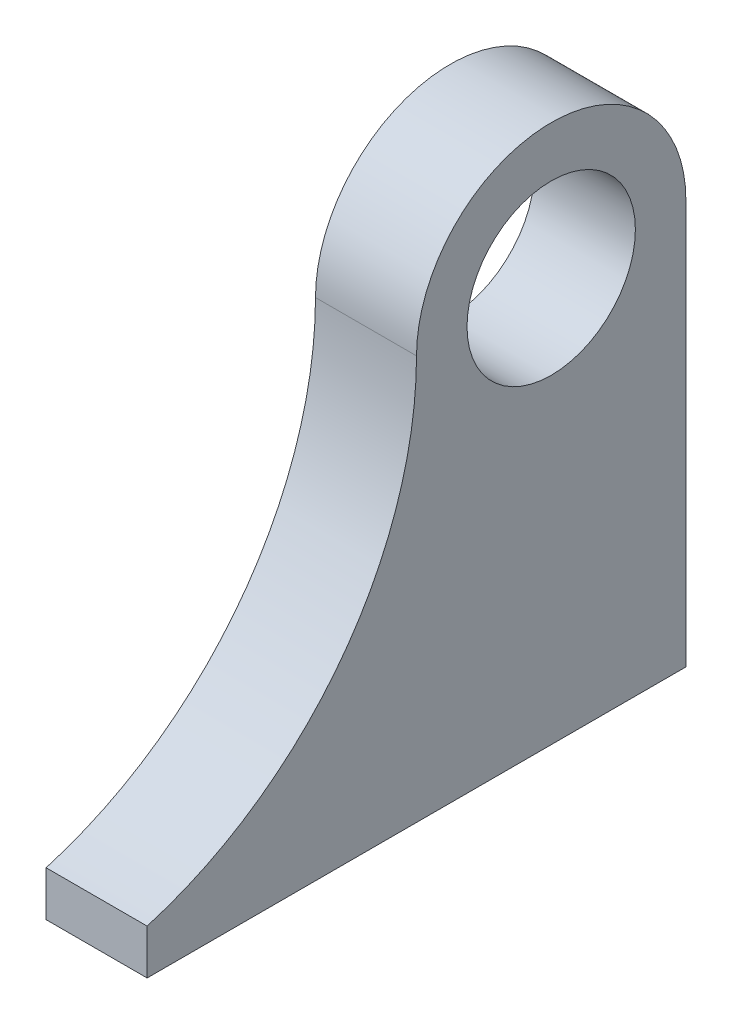
ISO-10303-21;
HEADER;
FILE_DESCRIPTION(('STEP AP214'),'2;1');
FILE_NAME('part.step','',(''),(''),'','','');
FILE_SCHEMA(('AUTOMOTIVE_DESIGN { 1 0 10303 214 1 1 1 1 }'));
ENDSEC;
DATA;
#1=APPLICATION_CONTEXT('core data for automotive mechanical design processes');
#2=APPLICATION_PROTOCOL_DEFINITION('international standard','automotive_design',2000,#1);
#3=PRODUCT_CONTEXT('',#1,'mechanical');
#4=PRODUCT('Part','Part','',(#3));
#5=PRODUCT_RELATED_PRODUCT_CATEGORY('part','',(#4));
#6=PRODUCT_DEFINITION_FORMATION('','',#4);
#7=PRODUCT_DEFINITION_CONTEXT('part definition',#1,'design');
#8=PRODUCT_DEFINITION('design','',#6,#7);
#9=PRODUCT_DEFINITION_SHAPE('','',#8);
#10=(LENGTH_UNIT() NAMED_UNIT(*) SI_UNIT(.MILLI.,.METRE.));
#11=(NAMED_UNIT(*) PLANE_ANGLE_UNIT() SI_UNIT($,.RADIAN.));
#12=(NAMED_UNIT(*) SI_UNIT($,.STERADIAN.) SOLID_ANGLE_UNIT());
#13=UNCERTAINTY_MEASURE_WITH_UNIT(LENGTH_MEASURE(1.E-05),#10,'distance_accuracy_value','');
#14=(GEOMETRIC_REPRESENTATION_CONTEXT(3) GLOBAL_UNCERTAINTY_ASSIGNED_CONTEXT((#13)) GLOBAL_UNIT_ASSIGNED_CONTEXT((#10,
#11,#12)) REPRESENTATION_CONTEXT('',''));
#15=CARTESIAN_POINT('',(0.,0.,0.));
#16=DIRECTION('',(0.,0.,1.));
#17=DIRECTION('',(1.,0.,0.));
#18=AXIS2_PLACEMENT_3D('',#15,#16,#17);
#19=CARTESIAN_POINT('',(602.191666666667,25.4,-454.152));
#20=DIRECTION('',(1.,0.,0.));
#21=DIRECTION('',(0.,0.,-1.));
#22=AXIS2_PLACEMENT_3D('',#19,#20,#21);
#23=PLANE('',#22);
#24=CARTESIAN_POINT('',(602.191666666667,19.05,-432.985333333333));
#25=DIRECTION('',(1.,0.,0.));
#26=DIRECTION('',(0.,0.,-1.));
#27=AXIS2_PLACEMENT_3D('',#24,#25,#26);
#28=CIRCLE('',#27,3.96875000000005);
#29=CARTESIAN_POINT('',(602.191666666667,19.05,-436.954083333333));
#30=VERTEX_POINT('',#29);
#31=EDGE_CURVE('E155',#30,#30,#28,.T.);
#32=ORIENTED_EDGE('',*,*,#31,.T.);
#33=EDGE_LOOP('',(#32));
#34=FACE_BOUND('',#33,.T.);
#35=CARTESIAN_POINT('',(602.191666666667,19.05,-432.985333333333));
#36=DIRECTION('',(1.,0.,0.));
#37=DIRECTION('',(0.,0.,-1.));
#38=AXIS2_PLACEMENT_3D('',#35,#36,#37);
#39=CIRCLE('',#38,6.35000000000002);
#40=CARTESIAN_POINT('',(602.191666666667,19.05,-439.335333333333));
#41=VERTEX_POINT('',#40);
#42=CARTESIAN_POINT('',(602.191666666667,19.05,-426.635333333333));
#43=VERTEX_POINT('',#42);
#44=EDGE_CURVE('E102',#41,#43,#39,.T.);
#45=ORIENTED_EDGE('',*,*,#44,.F.);
#46=DIRECTION('',(0.,-1.,0.));
#47=VECTOR('',#46,1.);
#48=CARTESIAN_POINT('',(602.191666666667,25.4,-439.335333333333));
#49=LINE('',#48,#47);
#50=CARTESIAN_POINT('',(602.191666666667,0.,-439.335333333333));
#51=VERTEX_POINT('',#50);
#52=EDGE_CURVE('E142',#41,#51,#49,.T.);
#53=ORIENTED_EDGE('',*,*,#52,.T.);
#54=DIRECTION('',(0.,0.,1.));
#55=VECTOR('',#54,1.);
#56=CARTESIAN_POINT('',(602.191666666667,0.,-454.152));
#57=LINE('',#56,#55);
#58=CARTESIAN_POINT('',(602.191666666667,0.,-413.935333333333));
#59=VERTEX_POINT('',#58);
#60=EDGE_CURVE('E94',#51,#59,#57,.T.);
#61=ORIENTED_EDGE('',*,*,#60,.T.);
#62=DIRECTION('',(0.,1.,0.));
#63=VECTOR('',#62,1.);
#64=CARTESIAN_POINT('',(602.191666666667,25.4,-413.935333333333));
#65=LINE('',#64,#63);
#66=CARTESIAN_POINT('',(602.191666666667,2.12,-413.935333333333));
#67=VERTEX_POINT('',#66);
#68=EDGE_CURVE('E163',#59,#67,#65,.T.);
#69=ORIENTED_EDGE('',*,*,#68,.T.);
#70=CARTESIAN_POINT('',(602.191666666667,19.0500000000001,-409.000888451443));
#71=DIRECTION('',(1.,0.,0.));
#72=DIRECTION('',(0.,0.,-1.));
#73=AXIS2_PLACEMENT_3D('',#70,#71,#72);
#74=CIRCLE('',#73,17.63444488189);
#75=EDGE_CURVE('E167',#67,#43,#74,.T.);
#76=ORIENTED_EDGE('',*,*,#75,.T.);
#77=EDGE_LOOP('',(#45,#53,#61,#69,#76));
#78=FACE_BOUND('',#77,.T.);
#79=ADVANCED_FACE('F80',(#34,#78),#23,.F.);
#80=CARTESIAN_POINT('',(606.954166666667,25.4,-454.152));
#81=DIRECTION('',(-1.,0.,0.));
#82=DIRECTION('',(0.,0.,1.));
#83=AXIS2_PLACEMENT_3D('',#80,#81,#82);
#84=PLANE('',#83);
#85=CARTESIAN_POINT('',(606.954166666667,19.05,-432.985333333333));
#86=DIRECTION('',(1.,0.,0.));
#87=DIRECTION('',(0.,0.,-1.));
#88=AXIS2_PLACEMENT_3D('',#85,#86,#87);
#89=CIRCLE('',#88,3.96875000000005);
#90=CARTESIAN_POINT('',(606.954166666667,19.05,-436.954083333333));
#91=VERTEX_POINT('',#90);
#92=EDGE_CURVE('E149',#91,#91,#89,.T.);
#93=ORIENTED_EDGE('',*,*,#92,.F.);
#94=EDGE_LOOP('',(#93));
#95=FACE_BOUND('',#94,.T.);
#96=DIRECTION('',(0.,-1.,0.));
#97=VECTOR('',#96,1.);
#98=CARTESIAN_POINT('',(606.954166666667,0.,-439.335333333333));
#99=LINE('',#98,#97);
#100=CARTESIAN_POINT('',(606.954166666667,19.05,-439.335333333333));
#101=VERTEX_POINT('',#100);
#102=CARTESIAN_POINT('',(606.954166666667,0.,-439.335333333333));
#103=VERTEX_POINT('',#102);
#104=EDGE_CURVE('E140',#101,#103,#99,.T.);
#105=ORIENTED_EDGE('',*,*,#104,.F.);
#106=CARTESIAN_POINT('',(606.954166666667,19.05,-432.985333333333));
#107=DIRECTION('',(1.,0.,0.));
#108=DIRECTION('',(0.,0.,-1.));
#109=AXIS2_PLACEMENT_3D('',#106,#107,#108);
#110=CIRCLE('',#109,6.35000000000002);
#111=CARTESIAN_POINT('',(606.954166666667,19.05,-426.635333333333));
#112=VERTEX_POINT('',#111);
#113=EDGE_CURVE('E125',#101,#112,#110,.T.);
#114=ORIENTED_EDGE('',*,*,#113,.T.);
#115=CARTESIAN_POINT('',(606.954166666667,19.0500000000001,-409.000888451443));
#116=DIRECTION('',(1.,0.,0.));
#117=DIRECTION('',(0.,0.,-1.));
#118=AXIS2_PLACEMENT_3D('',#115,#116,#117);
#119=CIRCLE('',#118,17.63444488189);
#120=CARTESIAN_POINT('',(606.954166666667,2.12,-413.935333333333));
#121=VERTEX_POINT('',#120);
#122=EDGE_CURVE('E135',#121,#112,#119,.T.);
#123=ORIENTED_EDGE('',*,*,#122,.F.);
#124=DIRECTION('',(0.,1.,0.));
#125=VECTOR('',#124,1.);
#126=CARTESIAN_POINT('',(606.954166666667,0.,-413.935333333333));
#127=LINE('',#126,#125);
#128=CARTESIAN_POINT('',(606.954166666667,0.,-413.935333333333));
#129=VERTEX_POINT('',#128);
#130=EDGE_CURVE('E158',#129,#121,#127,.T.);
#131=ORIENTED_EDGE('',*,*,#130,.F.);
#132=DIRECTION('',(0.,0.,-1.));
#133=VECTOR('',#132,1.);
#134=CARTESIAN_POINT('',(606.954166666667,0.,-454.152));
#135=LINE('',#134,#133);
#136=EDGE_CURVE('E148',#129,#103,#135,.T.);
#137=ORIENTED_EDGE('',*,*,#136,.T.);
#138=EDGE_LOOP('',(#105,#114,#123,#131,#137));
#139=FACE_BOUND('',#138,.T.);
#140=ADVANCED_FACE('F145',(#95,#139),#84,.F.);
#141=CARTESIAN_POINT('',(0.,0.,0.));
#142=DIRECTION('',(0.,-1.,0.));
#143=DIRECTION('',(0.,0.,-1.));
#144=AXIS2_PLACEMENT_3D('',#141,#142,#143);
#145=PLANE('',#144);
#146=DIRECTION('',(-1.,0.,0.));
#147=VECTOR('',#146,1.);
#148=CARTESIAN_POINT('',(0.,0.,-439.335333333333));
#149=LINE('',#148,#147);
#150=EDGE_CURVE('E12',#103,#51,#149,.T.);
#151=ORIENTED_EDGE('',*,*,#150,.F.);
#152=ORIENTED_EDGE('',*,*,#136,.F.);
#153=DIRECTION('',(1.,0.,0.));
#154=VECTOR('',#153,1.);
#155=CARTESIAN_POINT('',(0.,0.,-413.935333333333));
#156=LINE('',#155,#154);
#157=EDGE_CURVE('E87',#59,#129,#156,.T.);
#158=ORIENTED_EDGE('',*,*,#157,.F.);
#159=ORIENTED_EDGE('',*,*,#60,.F.);
#160=EDGE_LOOP('',(#151,#152,#158,#159));
#161=FACE_BOUND('',#160,.T.);
#162=ADVANCED_FACE('F176',(#161),#145,.T.);
#163=CARTESIAN_POINT('',(581.554166666667,19.0500000000001,-409.000888451443));
#164=DIRECTION('',(1.,0.,0.));
#165=DIRECTION('',(0.,0.,-1.));
#166=AXIS2_PLACEMENT_3D('',#163,#164,#165);
#167=CYLINDRICAL_SURFACE('',#166,17.63444488189);
#168=DIRECTION('',(1.,0.,0.));
#169=VECTOR('',#168,1.);
#170=CARTESIAN_POINT('',(581.554166666667,2.12,-413.935333333333));
#171=LINE('',#170,#169);
#172=EDGE_CURVE('E134',#67,#121,#171,.T.);
#173=ORIENTED_EDGE('',*,*,#172,.T.);
#174=ORIENTED_EDGE('',*,*,#122,.T.);
#175=DIRECTION('',(1.,0.,0.));
#176=VECTOR('',#175,1.);
#177=CARTESIAN_POINT('',(581.554166666667,19.05,-426.635333333333));
#178=LINE('',#177,#176);
#179=EDGE_CURVE('E129',#43,#112,#178,.T.);
#180=ORIENTED_EDGE('',*,*,#179,.F.);
#181=ORIENTED_EDGE('',*,*,#75,.F.);
#182=EDGE_LOOP('',(#173,#174,#180,#181));
#183=FACE_BOUND('',#182,.T.);
#184=ADVANCED_FACE('F178',(#183),#167,.F.);
#185=CARTESIAN_POINT('',(581.554166666667,19.05,-432.985333333333));
#186=DIRECTION('',(1.,0.,0.));
#187=DIRECTION('',(0.,0.,-1.));
#188=AXIS2_PLACEMENT_3D('',#185,#186,#187);
#189=CYLINDRICAL_SURFACE('',#188,6.35000000000002);
#190=ORIENTED_EDGE('',*,*,#44,.T.);
#191=ORIENTED_EDGE('',*,*,#179,.T.);
#192=ORIENTED_EDGE('',*,*,#113,.F.);
#193=DIRECTION('',(1.,0.,0.));
#194=VECTOR('',#193,1.);
#195=CARTESIAN_POINT('',(581.554166666667,19.05,-439.335333333333));
#196=LINE('',#195,#194);
#197=EDGE_CURVE('E128',#41,#101,#196,.T.);
#198=ORIENTED_EDGE('',*,*,#197,.F.);
#199=EDGE_LOOP('',(#190,#191,#192,#198));
#200=FACE_BOUND('',#199,.T.);
#201=ADVANCED_FACE('F127',(#200),#189,.T.);
#202=CARTESIAN_POINT('',(581.554166666667,0.,-413.935333333333));
#203=DIRECTION('',(0.,0.,-1.));
#204=DIRECTION('',(-1.,0.,0.));
#205=AXIS2_PLACEMENT_3D('',#202,#203,#204);
#206=PLANE('',#205);
#207=ORIENTED_EDGE('',*,*,#157,.T.);
#208=ORIENTED_EDGE('',*,*,#130,.T.);
#209=ORIENTED_EDGE('',*,*,#172,.F.);
#210=ORIENTED_EDGE('',*,*,#68,.F.);
#211=EDGE_LOOP('',(#207,#208,#209,#210));
#212=FACE_BOUND('',#211,.T.);
#213=ADVANCED_FACE('F173',(#212),#206,.F.);
#214=CARTESIAN_POINT('',(581.554166666667,0.,-439.335333333333));
#215=DIRECTION('',(0.,0.,1.));
#216=DIRECTION('',(1.,0.,0.));
#217=AXIS2_PLACEMENT_3D('',#214,#215,#216);
#218=PLANE('',#217);
#219=ORIENTED_EDGE('',*,*,#197,.T.);
#220=ORIENTED_EDGE('',*,*,#104,.T.);
#221=ORIENTED_EDGE('',*,*,#150,.T.);
#222=ORIENTED_EDGE('',*,*,#52,.F.);
#223=EDGE_LOOP('',(#219,#220,#221,#222));
#224=FACE_BOUND('',#223,.T.);
#225=ADVANCED_FACE('F139',(#224),#218,.F.);
#226=CARTESIAN_POINT('',(581.554166666667,19.05,-432.985333333333));
#227=DIRECTION('',(1.,0.,0.));
#228=DIRECTION('',(0.,0.,-1.));
#229=AXIS2_PLACEMENT_3D('',#226,#227,#228);
#230=CYLINDRICAL_SURFACE('',#229,3.96875000000005);
#231=ORIENTED_EDGE('',*,*,#92,.T.);
#232=EDGE_LOOP('',(#231));
#233=FACE_BOUND('',#232,.T.);
#234=ORIENTED_EDGE('',*,*,#31,.F.);
#235=EDGE_LOOP('',(#234));
#236=FACE_BOUND('',#235,.T.);
#237=ADVANCED_FACE('F196',(#233,#236),#230,.F.);
#238=CLOSED_SHELL('',(#79,#140,#162,#184,#201,#213,#225,#237));
#239=MANIFOLD_SOLID_BREP('B2',#238);
#240=ADVANCED_BREP_SHAPE_REPRESENTATION('',(#18,#239),#14);
#241=SHAPE_DEFINITION_REPRESENTATION(#9,#240);
ENDSEC;
END-ISO-10303-21;
